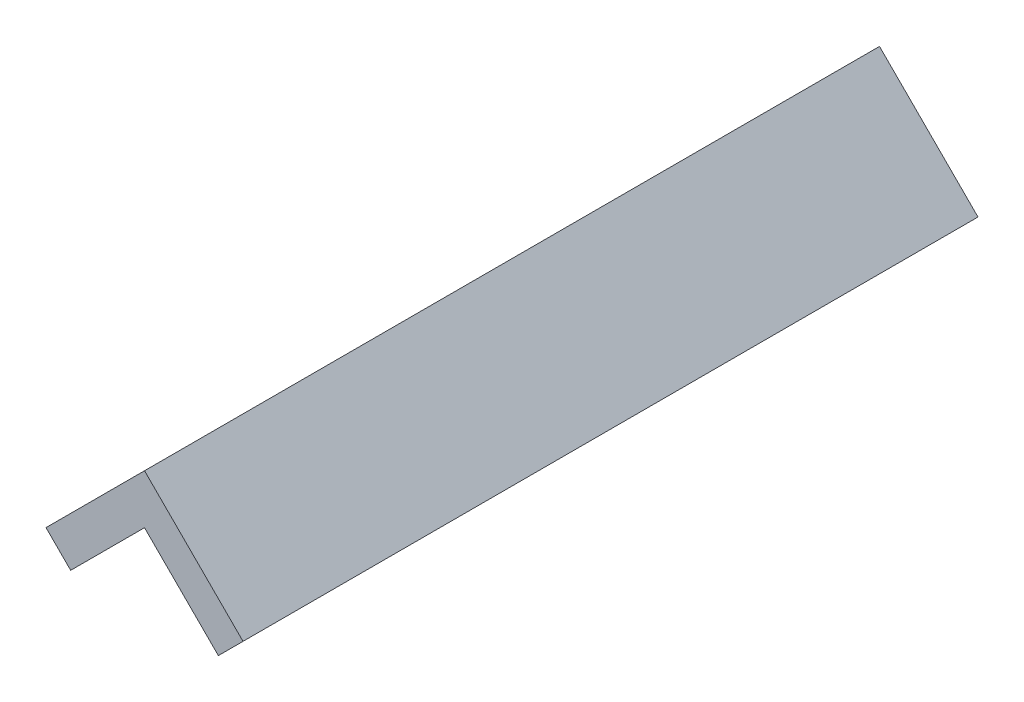
ISO-10303-21;
HEADER;
FILE_DESCRIPTION(('STEP AP214'),'2;1');
FILE_NAME('part.step','',(''),(''),'','','');
FILE_SCHEMA(('AUTOMOTIVE_DESIGN { 1 0 10303 214 1 1 1 1 }'));
ENDSEC;
DATA;
#1=APPLICATION_CONTEXT('core data for automotive mechanical design processes');
#2=APPLICATION_PROTOCOL_DEFINITION('international standard','automotive_design',2000,#1);
#3=PRODUCT_CONTEXT('',#1,'mechanical');
#4=PRODUCT('Part','Part','',(#3));
#5=PRODUCT_RELATED_PRODUCT_CATEGORY('part','',(#4));
#6=PRODUCT_DEFINITION_FORMATION('','',#4);
#7=PRODUCT_DEFINITION_CONTEXT('part definition',#1,'design');
#8=PRODUCT_DEFINITION('design','',#6,#7);
#9=PRODUCT_DEFINITION_SHAPE('','',#8);
#10=(LENGTH_UNIT() NAMED_UNIT(*) SI_UNIT(.MILLI.,.METRE.));
#11=(NAMED_UNIT(*) PLANE_ANGLE_UNIT() SI_UNIT($,.RADIAN.));
#12=(NAMED_UNIT(*) SI_UNIT($,.STERADIAN.) SOLID_ANGLE_UNIT());
#13=UNCERTAINTY_MEASURE_WITH_UNIT(LENGTH_MEASURE(1.E-05),#10,'distance_accuracy_value','');
#14=(GEOMETRIC_REPRESENTATION_CONTEXT(3) GLOBAL_UNCERTAINTY_ASSIGNED_CONTEXT((#13)) GLOBAL_UNIT_ASSIGNED_CONTEXT((#10,
#11,#12)) REPRESENTATION_CONTEXT('',''));
#15=CARTESIAN_POINT('',(0.,0.,0.));
#16=DIRECTION('',(0.,0.,1.));
#17=DIRECTION('',(1.,0.,0.));
#18=AXIS2_PLACEMENT_3D('',#15,#16,#17);
#19=CARTESIAN_POINT('',(8.98025612106917,8.98025612106913,67.));
#20=DIRECTION('',(0.707106781186546,-0.707106781186549,0.));
#21=DIRECTION('',(0.707106781186549,0.707106781186546,0.));
#22=AXIS2_PLACEMENT_3D('',#19,#20,#21);
#23=PLANE('',#22);
#24=DIRECTION('',(-0.707106781186549,-0.707106781186546,0.));
#25=VECTOR('',#24,1.);
#26=CARTESIAN_POINT('',(8.98025612106917,8.98025612106913,0.));
#27=LINE('',#26,#25);
#28=CARTESIAN_POINT('',(8.98025612106917,8.98025612106913,0.));
#29=VERTEX_POINT('',#28);
#30=CARTESIAN_POINT('',(0.,0.,0.));
#31=VERTEX_POINT('',#30);
#32=EDGE_CURVE('E119',#29,#31,#27,.T.);
#33=ORIENTED_EDGE('',*,*,#32,.T.);
#34=DIRECTION('',(0.,0.,-1.));
#35=VECTOR('',#34,1.);
#36=CARTESIAN_POINT('',(0.,0.,67.));
#37=LINE('',#36,#35);
#38=CARTESIAN_POINT('',(0.,0.,67.));
#39=VERTEX_POINT('',#38);
#40=EDGE_CURVE('E11',#39,#31,#37,.T.);
#41=ORIENTED_EDGE('',*,*,#40,.F.);
#42=DIRECTION('',(-0.707106781186549,-0.707106781186546,0.));
#43=VECTOR('',#42,1.);
#44=CARTESIAN_POINT('',(8.98025612106917,8.98025612106913,67.));
#45=LINE('',#44,#43);
#46=CARTESIAN_POINT('',(8.98025612106917,8.98025612106913,67.));
#47=VERTEX_POINT('',#46);
#48=EDGE_CURVE('E132',#47,#39,#45,.T.);
#49=ORIENTED_EDGE('',*,*,#48,.F.);
#50=DIRECTION('',(0.,0.,-1.));
#51=VECTOR('',#50,1.);
#52=CARTESIAN_POINT('',(8.98025612106917,8.98025612106913,67.));
#53=LINE('',#52,#51);
#54=EDGE_CURVE('E51',#47,#29,#53,.T.);
#55=ORIENTED_EDGE('',*,*,#54,.T.);
#56=EDGE_LOOP('',(#33,#41,#49,#55));
#57=FACE_BOUND('',#56,.T.);
#58=ADVANCED_FACE('F35',(#57),#23,.F.);
#59=CARTESIAN_POINT('',(0.,0.,67.));
#60=DIRECTION('',(0.707106781186547,0.707106781186547,0.));
#61=DIRECTION('',(-0.707106781186548,0.707106781186548,0.));
#62=AXIS2_PLACEMENT_3D('',#59,#60,#61);
#63=PLANE('',#62);
#64=DIRECTION('',(0.707106781186547,-0.707106781186547,0.));
#65=VECTOR('',#64,1.);
#66=CARTESIAN_POINT('',(0.,0.,0.));
#67=LINE('',#66,#65);
#68=CARTESIAN_POINT('',(2.24859956417322,-2.24859956417322,0.));
#69=VERTEX_POINT('',#68);
#70=EDGE_CURVE('E121',#31,#69,#67,.T.);
#71=ORIENTED_EDGE('',*,*,#70,.T.);
#72=DIRECTION('',(0.,0.,-1.));
#73=VECTOR('',#72,1.);
#74=CARTESIAN_POINT('',(2.24859956417322,-2.24859956417322,67.));
#75=LINE('',#74,#73);
#76=CARTESIAN_POINT('',(2.24859956417322,-2.24859956417322,67.));
#77=VERTEX_POINT('',#76);
#78=EDGE_CURVE('E43',#77,#69,#75,.T.);
#79=ORIENTED_EDGE('',*,*,#78,.F.);
#80=DIRECTION('',(0.707106781186547,-0.707106781186547,0.));
#81=VECTOR('',#80,1.);
#82=CARTESIAN_POINT('',(0.,0.,67.));
#83=LINE('',#82,#81);
#84=EDGE_CURVE('E83',#39,#77,#83,.T.);
#85=ORIENTED_EDGE('',*,*,#84,.F.);
#86=ORIENTED_EDGE('',*,*,#40,.T.);
#87=EDGE_LOOP('',(#71,#79,#85,#86));
#88=FACE_BOUND('',#87,.T.);
#89=ADVANCED_FACE('F152',(#88),#63,.F.);
#90=CARTESIAN_POINT('',(2.24859956417322,-2.24859956417322,67.));
#91=DIRECTION('',(-0.707106781186547,0.707106781186547,0.));
#92=DIRECTION('',(-0.707106781186548,-0.707106781186548,0.));
#93=AXIS2_PLACEMENT_3D('',#90,#91,#92);
#94=PLANE('',#93);
#95=DIRECTION('',(0.707106781186547,0.707106781186547,0.));
#96=VECTOR('',#95,1.);
#97=CARTESIAN_POINT('',(2.24859956417322,-2.24859956417322,0.));
#98=LINE('',#97,#96);
#99=CARTESIAN_POINT('',(8.98025612106916,4.48305699272272,0.));
#100=VERTEX_POINT('',#99);
#101=EDGE_CURVE('E123',#69,#100,#98,.T.);
#102=ORIENTED_EDGE('',*,*,#101,.T.);
#103=DIRECTION('',(0.,0.,-1.));
#104=VECTOR('',#103,1.);
#105=CARTESIAN_POINT('',(8.98025612106916,4.48305699272272,67.));
#106=LINE('',#105,#104);
#107=CARTESIAN_POINT('',(8.98025612106916,4.48305699272272,67.));
#108=VERTEX_POINT('',#107);
#109=EDGE_CURVE('E102',#108,#100,#106,.T.);
#110=ORIENTED_EDGE('',*,*,#109,.F.);
#111=DIRECTION('',(0.707106781186547,0.707106781186547,0.));
#112=VECTOR('',#111,1.);
#113=CARTESIAN_POINT('',(2.24859956417322,-2.24859956417322,67.));
#114=LINE('',#113,#112);
#115=EDGE_CURVE('E110',#77,#108,#114,.T.);
#116=ORIENTED_EDGE('',*,*,#115,.F.);
#117=ORIENTED_EDGE('',*,*,#78,.T.);
#118=EDGE_LOOP('',(#102,#110,#116,#117));
#119=FACE_BOUND('',#118,.T.);
#120=ADVANCED_FACE('F138',(#119),#94,.F.);
#121=CARTESIAN_POINT('',(15.7119126779651,-2.2485995641732,67.));
#122=DIRECTION('',(-0.707106781186545,-0.70710678118655,0.));
#123=DIRECTION('',(0.70710678118655,-0.707106781186545,0.));
#124=AXIS2_PLACEMENT_3D('',#121,#122,#123);
#125=PLANE('',#124);
#126=DIRECTION('',(-0.70710678118655,0.707106781186545,0.));
#127=VECTOR('',#126,1.);
#128=CARTESIAN_POINT('',(15.7119126779651,-2.2485995641732,0.));
#129=LINE('',#128,#127);
#130=CARTESIAN_POINT('',(15.7119126779651,-2.2485995641732,0.));
#131=VERTEX_POINT('',#130);
#132=EDGE_CURVE('E98',#131,#100,#129,.T.);
#133=ORIENTED_EDGE('',*,*,#132,.F.);
#134=DIRECTION('',(0.,0.,-1.));
#135=VECTOR('',#134,1.);
#136=CARTESIAN_POINT('',(15.7119126779651,-2.2485995641732,67.));
#137=LINE('',#136,#135);
#138=CARTESIAN_POINT('',(15.7119126779651,-2.2485995641732,67.));
#139=VERTEX_POINT('',#138);
#140=EDGE_CURVE('E93',#139,#131,#137,.T.);
#141=ORIENTED_EDGE('',*,*,#140,.F.);
#142=DIRECTION('',(-0.70710678118655,0.707106781186545,0.));
#143=VECTOR('',#142,1.);
#144=CARTESIAN_POINT('',(15.7119126779651,-2.2485995641732,67.));
#145=LINE('',#144,#143);
#146=EDGE_CURVE('E96',#139,#108,#145,.T.);
#147=ORIENTED_EDGE('',*,*,#146,.T.);
#148=ORIENTED_EDGE('',*,*,#109,.T.);
#149=EDGE_LOOP('',(#133,#141,#147,#148));
#150=FACE_BOUND('',#149,.T.);
#151=ADVANCED_FACE('F95',(#150),#125,.T.);
#152=CARTESIAN_POINT('',(17.9605122421383,0.,67.));
#153=DIRECTION('',(0.70710678118655,-0.707106781186545,0.));
#154=DIRECTION('',(0.707106781186545,0.70710678118655,0.));
#155=AXIS2_PLACEMENT_3D('',#152,#153,#154);
#156=PLANE('',#155);
#157=DIRECTION('',(-0.707106781186545,-0.70710678118655,0.));
#158=VECTOR('',#157,1.);
#159=CARTESIAN_POINT('',(17.9605122421383,0.,0.));
#160=LINE('',#159,#158);
#161=CARTESIAN_POINT('',(17.9605122421383,0.,0.));
#162=VERTEX_POINT('',#161);
#163=EDGE_CURVE('E127',#162,#131,#160,.T.);
#164=ORIENTED_EDGE('',*,*,#163,.F.);
#165=DIRECTION('',(0.,0.,-1.));
#166=VECTOR('',#165,1.);
#167=CARTESIAN_POINT('',(17.9605122421383,0.,67.));
#168=LINE('',#167,#166);
#169=CARTESIAN_POINT('',(17.9605122421383,0.,67.));
#170=VERTEX_POINT('',#169);
#171=EDGE_CURVE('E71',#170,#162,#168,.T.);
#172=ORIENTED_EDGE('',*,*,#171,.F.);
#173=DIRECTION('',(-0.707106781186545,-0.70710678118655,0.));
#174=VECTOR('',#173,1.);
#175=CARTESIAN_POINT('',(17.9605122421383,0.,67.));
#176=LINE('',#175,#174);
#177=EDGE_CURVE('E108',#170,#139,#176,.T.);
#178=ORIENTED_EDGE('',*,*,#177,.T.);
#179=ORIENTED_EDGE('',*,*,#140,.T.);
#180=EDGE_LOOP('',(#164,#172,#178,#179));
#181=FACE_BOUND('',#180,.T.);
#182=ADVANCED_FACE('F113',(#181),#156,.T.);
#183=CARTESIAN_POINT('',(8.98025612106917,8.98025612106913,67.));
#184=DIRECTION('',(0.707106781186545,0.70710678118655,0.));
#185=DIRECTION('',(-0.70710678118655,0.707106781186545,0.));
#186=AXIS2_PLACEMENT_3D('',#183,#184,#185);
#187=PLANE('',#186);
#188=DIRECTION('',(0.70710678118655,-0.707106781186545,0.));
#189=VECTOR('',#188,1.);
#190=CARTESIAN_POINT('',(8.98025612106917,8.98025612106913,0.));
#191=LINE('',#190,#189);
#192=EDGE_CURVE('E129',#29,#162,#191,.T.);
#193=ORIENTED_EDGE('',*,*,#192,.F.);
#194=ORIENTED_EDGE('',*,*,#54,.F.);
#195=DIRECTION('',(0.70710678118655,-0.707106781186545,0.));
#196=VECTOR('',#195,1.);
#197=CARTESIAN_POINT('',(8.98025612106917,8.98025612106913,67.));
#198=LINE('',#197,#196);
#199=EDGE_CURVE('E114',#47,#170,#198,.T.);
#200=ORIENTED_EDGE('',*,*,#199,.T.);
#201=ORIENTED_EDGE('',*,*,#171,.T.);
#202=EDGE_LOOP('',(#193,#194,#200,#201));
#203=FACE_BOUND('',#202,.T.);
#204=ADVANCED_FACE('F141',(#203),#187,.T.);
#205=CARTESIAN_POINT('',(0.,0.,67.));
#206=DIRECTION('',(0.,0.,1.));
#207=DIRECTION('',(1.,0.,0.));
#208=AXIS2_PLACEMENT_3D('',#205,#206,#207);
#209=PLANE('',#208);
#210=ORIENTED_EDGE('',*,*,#48,.T.);
#211=ORIENTED_EDGE('',*,*,#84,.T.);
#212=ORIENTED_EDGE('',*,*,#115,.T.);
#213=ORIENTED_EDGE('',*,*,#146,.F.);
#214=ORIENTED_EDGE('',*,*,#177,.F.);
#215=ORIENTED_EDGE('',*,*,#199,.F.);
#216=EDGE_LOOP('',(#210,#211,#212,#213,#214,#215));
#217=FACE_BOUND('',#216,.T.);
#218=ADVANCED_FACE('F106',(#217),#209,.T.);
#219=CARTESIAN_POINT('',(0.,0.,0.));
#220=DIRECTION('',(0.,0.,1.));
#221=DIRECTION('',(1.,0.,0.));
#222=AXIS2_PLACEMENT_3D('',#219,#220,#221);
#223=PLANE('',#222);
#224=ORIENTED_EDGE('',*,*,#32,.F.);
#225=ORIENTED_EDGE('',*,*,#192,.T.);
#226=ORIENTED_EDGE('',*,*,#163,.T.);
#227=ORIENTED_EDGE('',*,*,#132,.T.);
#228=ORIENTED_EDGE('',*,*,#101,.F.);
#229=ORIENTED_EDGE('',*,*,#70,.F.);
#230=EDGE_LOOP('',(#224,#225,#226,#227,#228,#229));
#231=FACE_BOUND('',#230,.T.);
#232=ADVANCED_FACE('F140',(#231),#223,.F.);
#233=CLOSED_SHELL('',(#58,#89,#120,#151,#182,#204,#218,#232));
#234=MANIFOLD_SOLID_BREP('B2',#233);
#235=ADVANCED_BREP_SHAPE_REPRESENTATION('',(#18,#234),#14);
#236=SHAPE_DEFINITION_REPRESENTATION(#9,#235);
ENDSEC;
END-ISO-10303-21;
